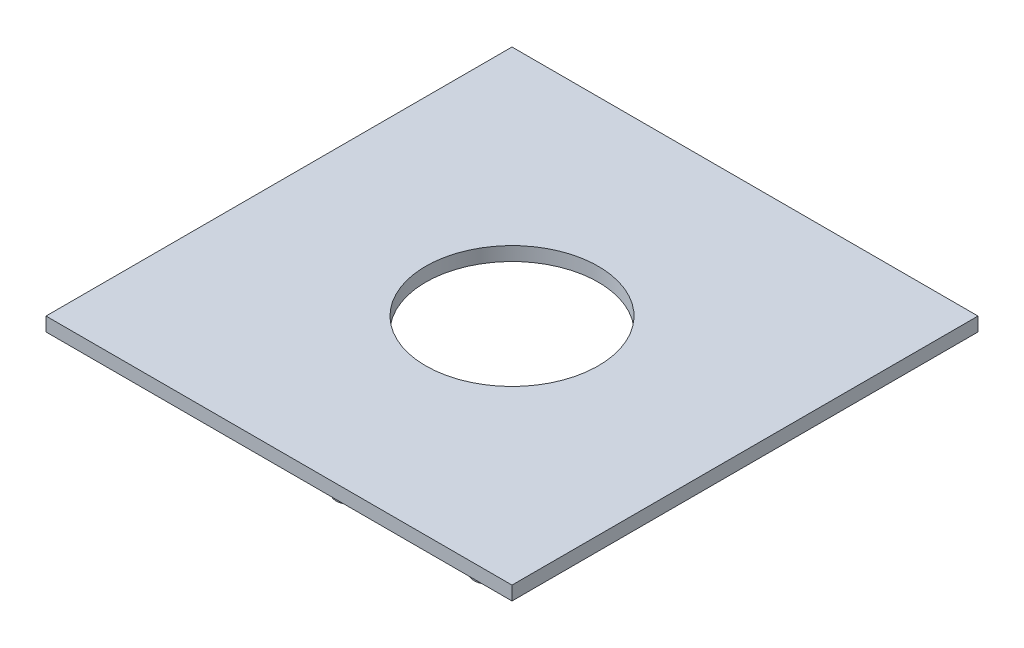
ISO-10303-21;
HEADER;
FILE_DESCRIPTION(('STEP AP214'),'2;1');
FILE_NAME('part.step','',(''),(''),'','','');
FILE_SCHEMA(('AUTOMOTIVE_DESIGN { 1 0 10303 214 1 1 1 1 }'));
ENDSEC;
DATA;
#1=APPLICATION_CONTEXT('core data for automotive mechanical design processes');
#2=APPLICATION_PROTOCOL_DEFINITION('international standard','automotive_design',2000,#1);
#3=PRODUCT_CONTEXT('',#1,'mechanical');
#4=PRODUCT('Part','Part','',(#3));
#5=PRODUCT_RELATED_PRODUCT_CATEGORY('part','',(#4));
#6=PRODUCT_DEFINITION_FORMATION('','',#4);
#7=PRODUCT_DEFINITION_CONTEXT('part definition',#1,'design');
#8=PRODUCT_DEFINITION('design','',#6,#7);
#9=PRODUCT_DEFINITION_SHAPE('','',#8);
#10=(LENGTH_UNIT() NAMED_UNIT(*) SI_UNIT(.MILLI.,.METRE.));
#11=(NAMED_UNIT(*) PLANE_ANGLE_UNIT() SI_UNIT($,.RADIAN.));
#12=(NAMED_UNIT(*) SI_UNIT($,.STERADIAN.) SOLID_ANGLE_UNIT());
#13=UNCERTAINTY_MEASURE_WITH_UNIT(LENGTH_MEASURE(1.E-05),#10,'distance_accuracy_value','');
#14=(GEOMETRIC_REPRESENTATION_CONTEXT(3) GLOBAL_UNCERTAINTY_ASSIGNED_CONTEXT((#13)) GLOBAL_UNIT_ASSIGNED_CONTEXT((#10,
#11,#12)) REPRESENTATION_CONTEXT('',''));
#15=CARTESIAN_POINT('',(0.,0.,0.));
#16=DIRECTION('',(0.,0.,1.));
#17=DIRECTION('',(1.,0.,0.));
#18=AXIS2_PLACEMENT_3D('',#15,#16,#17);
#19=CARTESIAN_POINT('',(67.5,4.,0.));
#20=DIRECTION('',(1.,0.,0.));
#21=DIRECTION('',(0.,0.,-1.));
#22=AXIS2_PLACEMENT_3D('',#19,#20,#21);
#23=PLANE('',#22);
#24=DIRECTION('',(0.,0.,1.));
#25=VECTOR('',#24,1.);
#26=CARTESIAN_POINT('',(67.5,0.,0.));
#27=LINE('',#26,#25);
#28=CARTESIAN_POINT('',(67.5,0.,-67.5));
#29=VERTEX_POINT('',#28);
#30=CARTESIAN_POINT('',(67.5,0.,67.5));
#31=VERTEX_POINT('',#30);
#32=EDGE_CURVE('E117',#29,#31,#27,.T.);
#33=ORIENTED_EDGE('',*,*,#32,.F.);
#34=DIRECTION('',(0.,-1.,0.));
#35=VECTOR('',#34,1.);
#36=CARTESIAN_POINT('',(67.5,4.,-67.5));
#37=LINE('',#36,#35);
#38=CARTESIAN_POINT('',(67.5,4.,-67.5));
#39=VERTEX_POINT('',#38);
#40=EDGE_CURVE('E11',#39,#29,#37,.T.);
#41=ORIENTED_EDGE('',*,*,#40,.F.);
#42=DIRECTION('',(0.,0.,1.));
#43=VECTOR('',#42,1.);
#44=CARTESIAN_POINT('',(67.5,4.,0.));
#45=LINE('',#44,#43);
#46=CARTESIAN_POINT('',(67.5,4.,67.5));
#47=VERTEX_POINT('',#46);
#48=EDGE_CURVE('E107',#39,#47,#45,.T.);
#49=ORIENTED_EDGE('',*,*,#48,.T.);
#50=DIRECTION('',(0.,-1.,0.));
#51=VECTOR('',#50,1.);
#52=CARTESIAN_POINT('',(67.5,4.,67.5));
#53=LINE('',#52,#51);
#54=EDGE_CURVE('E85',#47,#31,#53,.T.);
#55=ORIENTED_EDGE('',*,*,#54,.T.);
#56=EDGE_LOOP('',(#33,#41,#49,#55));
#57=FACE_BOUND('',#56,.T.);
#58=ADVANCED_FACE('F45',(#57),#23,.T.);
#59=CARTESIAN_POINT('',(0.,4.,-67.5));
#60=DIRECTION('',(0.,0.,-1.));
#61=DIRECTION('',(-1.,0.,0.));
#62=AXIS2_PLACEMENT_3D('',#59,#60,#61);
#63=PLANE('',#62);
#64=DIRECTION('',(1.,0.,0.));
#65=VECTOR('',#64,1.);
#66=CARTESIAN_POINT('',(0.,0.,-67.5));
#67=LINE('',#66,#65);
#68=CARTESIAN_POINT('',(-67.5,0.,-67.5));
#69=VERTEX_POINT('',#68);
#70=EDGE_CURVE('E98',#69,#29,#67,.T.);
#71=ORIENTED_EDGE('',*,*,#70,.F.);
#72=DIRECTION('',(0.,-1.,0.));
#73=VECTOR('',#72,1.);
#74=CARTESIAN_POINT('',(-67.5,4.,-67.5));
#75=LINE('',#74,#73);
#76=CARTESIAN_POINT('',(-67.5,4.,-67.5));
#77=VERTEX_POINT('',#76);
#78=EDGE_CURVE('E55',#77,#69,#75,.T.);
#79=ORIENTED_EDGE('',*,*,#78,.F.);
#80=DIRECTION('',(1.,0.,0.));
#81=VECTOR('',#80,1.);
#82=CARTESIAN_POINT('',(0.,4.,-67.5));
#83=LINE('',#82,#81);
#84=EDGE_CURVE('E96',#77,#39,#83,.T.);
#85=ORIENTED_EDGE('',*,*,#84,.T.);
#86=ORIENTED_EDGE('',*,*,#40,.T.);
#87=EDGE_LOOP('',(#71,#79,#85,#86));
#88=FACE_BOUND('',#87,.T.);
#89=ADVANCED_FACE('F94',(#88),#63,.T.);
#90=CARTESIAN_POINT('',(-67.5,4.,0.));
#91=DIRECTION('',(1.,0.,0.));
#92=DIRECTION('',(0.,0.,-1.));
#93=AXIS2_PLACEMENT_3D('',#90,#91,#92);
#94=PLANE('',#93);
#95=DIRECTION('',(0.,0.,1.));
#96=VECTOR('',#95,1.);
#97=CARTESIAN_POINT('',(-67.5,0.,0.));
#98=LINE('',#97,#96);
#99=CARTESIAN_POINT('',(-67.5,0.,67.5));
#100=VERTEX_POINT('',#99);
#101=EDGE_CURVE('E78',#69,#100,#98,.T.);
#102=ORIENTED_EDGE('',*,*,#101,.T.);
#103=DIRECTION('',(0.,-1.,0.));
#104=VECTOR('',#103,1.);
#105=CARTESIAN_POINT('',(-67.5,4.,67.5));
#106=LINE('',#105,#104);
#107=CARTESIAN_POINT('',(-67.5,4.,67.5));
#108=VERTEX_POINT('',#107);
#109=EDGE_CURVE('E100',#108,#100,#106,.T.);
#110=ORIENTED_EDGE('',*,*,#109,.F.);
#111=DIRECTION('',(0.,0.,1.));
#112=VECTOR('',#111,1.);
#113=CARTESIAN_POINT('',(-67.5,4.,0.));
#114=LINE('',#113,#112);
#115=EDGE_CURVE('E102',#77,#108,#114,.T.);
#116=ORIENTED_EDGE('',*,*,#115,.F.);
#117=ORIENTED_EDGE('',*,*,#78,.T.);
#118=EDGE_LOOP('',(#102,#110,#116,#117));
#119=FACE_BOUND('',#118,.T.);
#120=ADVANCED_FACE('F103',(#119),#94,.F.);
#121=CARTESIAN_POINT('',(0.,4.,67.5));
#122=DIRECTION('',(0.,0.,-1.));
#123=DIRECTION('',(-1.,0.,0.));
#124=AXIS2_PLACEMENT_3D('',#121,#122,#123);
#125=PLANE('',#124);
#126=DIRECTION('',(1.,0.,0.));
#127=VECTOR('',#126,1.);
#128=CARTESIAN_POINT('',(0.,0.,67.5));
#129=LINE('',#128,#127);
#130=EDGE_CURVE('E111',#100,#31,#129,.T.);
#131=ORIENTED_EDGE('',*,*,#130,.T.);
#132=ORIENTED_EDGE('',*,*,#54,.F.);
#133=DIRECTION('',(1.,0.,0.));
#134=VECTOR('',#133,1.);
#135=CARTESIAN_POINT('',(0.,4.,67.5));
#136=LINE('',#135,#134);
#137=EDGE_CURVE('E63',#108,#47,#136,.T.);
#138=ORIENTED_EDGE('',*,*,#137,.F.);
#139=ORIENTED_EDGE('',*,*,#109,.T.);
#140=EDGE_LOOP('',(#131,#132,#138,#139));
#141=FACE_BOUND('',#140,.T.);
#142=ADVANCED_FACE('F133',(#141),#125,.F.);
#143=CARTESIAN_POINT('',(0.,4.,0.));
#144=DIRECTION('',(0.,1.,0.));
#145=DIRECTION('',(0.,0.,1.));
#146=AXIS2_PLACEMENT_3D('',#143,#144,#145);
#147=PLANE('',#146);
#148=CARTESIAN_POINT('',(0.,4.,0.));
#149=DIRECTION('',(0.,1.,0.));
#150=DIRECTION('',(0.,0.,1.));
#151=AXIS2_PLACEMENT_3D('',#148,#149,#150);
#152=CIRCLE('',#151,25.);
#153=CARTESIAN_POINT('',(0.,4.,25.));
#154=VERTEX_POINT('',#153);
#155=EDGE_CURVE('E177',#154,#154,#152,.T.);
#156=ORIENTED_EDGE('',*,*,#155,.F.);
#157=EDGE_LOOP('',(#156));
#158=FACE_BOUND('',#157,.T.);
#159=ORIENTED_EDGE('',*,*,#48,.F.);
#160=ORIENTED_EDGE('',*,*,#84,.F.);
#161=ORIENTED_EDGE('',*,*,#115,.T.);
#162=ORIENTED_EDGE('',*,*,#137,.T.);
#163=EDGE_LOOP('',(#159,#160,#161,#162));
#164=FACE_BOUND('',#163,.T.);
#165=ADVANCED_FACE('F106',(#158,#164),#147,.T.);
#166=CARTESIAN_POINT('',(0.,0.,0.));
#167=DIRECTION('',(0.,1.,0.));
#168=DIRECTION('',(0.,0.,1.));
#169=AXIS2_PLACEMENT_3D('',#166,#167,#168);
#170=PLANE('',#169);
#171=CARTESIAN_POINT('',(0.,0.,0.));
#172=DIRECTION('',(0.,1.,0.));
#173=DIRECTION('',(0.,0.,1.));
#174=AXIS2_PLACEMENT_3D('',#171,#172,#173);
#175=CIRCLE('',#174,25.);
#176=CARTESIAN_POINT('',(0.,0.,25.));
#177=VERTEX_POINT('',#176);
#178=EDGE_CURVE('E48',#177,#177,#175,.T.);
#179=ORIENTED_EDGE('',*,*,#178,.T.);
#180=EDGE_LOOP('',(#179));
#181=FACE_BOUND('',#180,.T.);
#182=CARTESIAN_POINT('',(52.5,0.,59.5));
#183=DIRECTION('',(0.,1.,0.));
#184=DIRECTION('',(0.,0.,1.));
#185=AXIS2_PLACEMENT_3D('',#182,#183,#184);
#186=CIRCLE('',#185,3.9);
#187=CARTESIAN_POINT('',(52.5,0.,63.4));
#188=VERTEX_POINT('',#187);
#189=EDGE_CURVE('E185',#188,#188,#186,.T.);
#190=ORIENTED_EDGE('',*,*,#189,.T.);
#191=EDGE_LOOP('',(#190));
#192=FACE_BOUND('',#191,.T.);
#193=CARTESIAN_POINT('',(12.5,0.,59.5));
#194=DIRECTION('',(0.,1.,0.));
#195=DIRECTION('',(0.,0.,1.));
#196=AXIS2_PLACEMENT_3D('',#193,#194,#195);
#197=CIRCLE('',#196,3.9);
#198=CARTESIAN_POINT('',(12.5,0.,63.4));
#199=VERTEX_POINT('',#198);
#200=EDGE_CURVE('E191',#199,#199,#197,.T.);
#201=ORIENTED_EDGE('',*,*,#200,.T.);
#202=EDGE_LOOP('',(#201));
#203=FACE_BOUND('',#202,.T.);
#204=ORIENTED_EDGE('',*,*,#32,.T.);
#205=ORIENTED_EDGE('',*,*,#130,.F.);
#206=ORIENTED_EDGE('',*,*,#101,.F.);
#207=ORIENTED_EDGE('',*,*,#70,.T.);
#208=EDGE_LOOP('',(#204,#205,#206,#207));
#209=FACE_BOUND('',#208,.T.);
#210=ADVANCED_FACE('F135',(#181,#192,#203,#209),#170,.F.);
#211=CARTESIAN_POINT('',(12.5,-4.5,59.5));
#212=DIRECTION('',(0.,1.,0.));
#213=DIRECTION('',(0.,0.,1.));
#214=AXIS2_PLACEMENT_3D('',#211,#212,#213);
#215=CYLINDRICAL_SURFACE('',#214,3.9);
#216=CARTESIAN_POINT('',(12.5,-4.5,59.5));
#217=DIRECTION('',(0.,1.,0.));
#218=DIRECTION('',(0.,0.,1.));
#219=AXIS2_PLACEMENT_3D('',#216,#217,#218);
#220=CIRCLE('',#219,3.9);
#221=CARTESIAN_POINT('',(12.5,-4.5,63.4));
#222=VERTEX_POINT('',#221);
#223=EDGE_CURVE('E121',#222,#222,#220,.T.);
#224=ORIENTED_EDGE('',*,*,#223,.T.);
#225=EDGE_LOOP('',(#224));
#226=FACE_BOUND('',#225,.T.);
#227=ORIENTED_EDGE('',*,*,#200,.F.);
#228=EDGE_LOOP('',(#227));
#229=FACE_BOUND('',#228,.T.);
#230=ADVANCED_FACE('F149',(#226,#229),#215,.T.);
#231=CARTESIAN_POINT('',(12.5,-4.5,59.5));
#232=DIRECTION('',(0.,1.,0.));
#233=DIRECTION('',(0.,0.,1.));
#234=AXIS2_PLACEMENT_3D('',#231,#232,#233);
#235=PLANE('',#234);
#236=ORIENTED_EDGE('',*,*,#223,.F.);
#237=EDGE_LOOP('',(#236));
#238=FACE_BOUND('',#237,.T.);
#239=ADVANCED_FACE('F156',(#238),#235,.F.);
#240=CARTESIAN_POINT('',(52.5,-4.5,59.5));
#241=DIRECTION('',(0.,1.,0.));
#242=DIRECTION('',(0.,0.,1.));
#243=AXIS2_PLACEMENT_3D('',#240,#241,#242);
#244=CYLINDRICAL_SURFACE('',#243,3.9);
#245=CARTESIAN_POINT('',(52.5,-4.5,59.5));
#246=DIRECTION('',(0.,1.,0.));
#247=DIRECTION('',(0.,0.,1.));
#248=AXIS2_PLACEMENT_3D('',#245,#246,#247);
#249=CIRCLE('',#248,3.9);
#250=CARTESIAN_POINT('',(52.5,-4.5,63.4));
#251=VERTEX_POINT('',#250);
#252=EDGE_CURVE('E181',#251,#251,#249,.T.);
#253=ORIENTED_EDGE('',*,*,#252,.T.);
#254=EDGE_LOOP('',(#253));
#255=FACE_BOUND('',#254,.T.);
#256=ORIENTED_EDGE('',*,*,#189,.F.);
#257=EDGE_LOOP('',(#256));
#258=FACE_BOUND('',#257,.T.);
#259=ADVANCED_FACE('F160',(#255,#258),#244,.T.);
#260=CARTESIAN_POINT('',(52.5,-4.5,59.5));
#261=DIRECTION('',(0.,1.,0.));
#262=DIRECTION('',(0.,0.,1.));
#263=AXIS2_PLACEMENT_3D('',#260,#261,#262);
#264=PLANE('',#263);
#265=ORIENTED_EDGE('',*,*,#252,.F.);
#266=EDGE_LOOP('',(#265));
#267=FACE_BOUND('',#266,.T.);
#268=ADVANCED_FACE('F162',(#267),#264,.F.);
#269=CARTESIAN_POINT('',(0.,-6.,0.));
#270=DIRECTION('',(0.,1.,0.));
#271=DIRECTION('',(0.,0.,1.));
#272=AXIS2_PLACEMENT_3D('',#269,#270,#271);
#273=CYLINDRICAL_SURFACE('',#272,25.);
#274=ORIENTED_EDGE('',*,*,#155,.T.);
#275=EDGE_LOOP('',(#274));
#276=FACE_BOUND('',#275,.T.);
#277=ORIENTED_EDGE('',*,*,#178,.F.);
#278=EDGE_LOOP('',(#277));
#279=FACE_BOUND('',#278,.T.);
#280=ADVANCED_FACE('F165',(#276,#279),#273,.F.);
#281=CLOSED_SHELL('',(#58,#89,#120,#142,#165,#210,#230,#239,#259,#268,#280));
#282=MANIFOLD_SOLID_BREP('B2',#281);
#283=ADVANCED_BREP_SHAPE_REPRESENTATION('',(#18,#282),#14);
#284=SHAPE_DEFINITION_REPRESENTATION(#9,#283);
ENDSEC;
END-ISO-10303-21;
